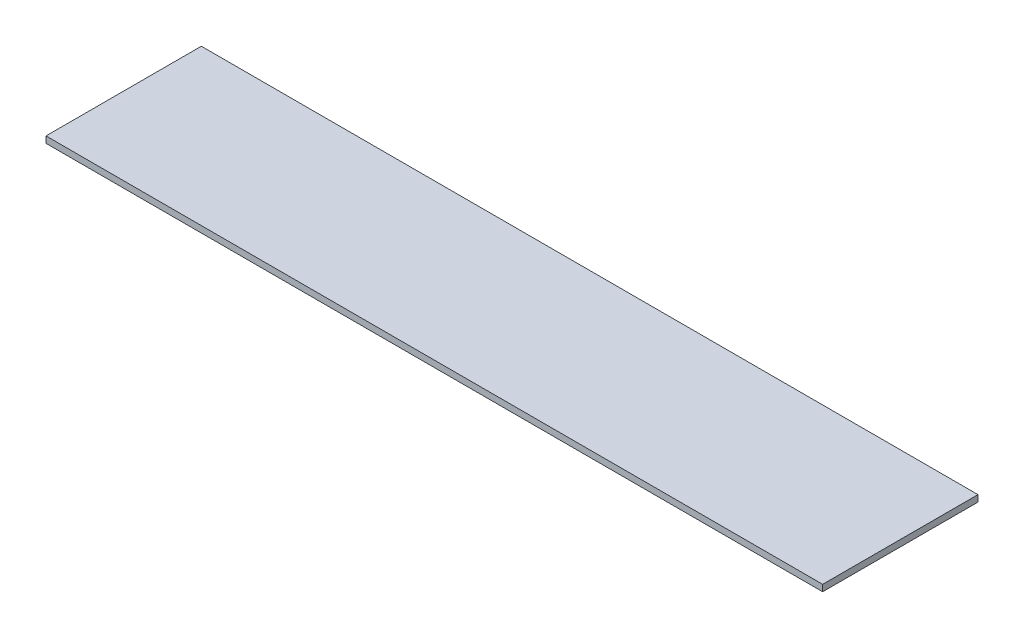
ISO-10303-21;
HEADER;
FILE_DESCRIPTION(('STEP AP214'),'2;1');
FILE_NAME('part.step','',(''),(''),'','','');
FILE_SCHEMA(('AUTOMOTIVE_DESIGN { 1 0 10303 214 1 1 1 1 }'));
ENDSEC;
DATA;
#1=APPLICATION_CONTEXT('core data for automotive mechanical design processes');
#2=APPLICATION_PROTOCOL_DEFINITION('international standard','automotive_design',2000,#1);
#3=PRODUCT_CONTEXT('',#1,'mechanical');
#4=PRODUCT('Part','Part','',(#3));
#5=PRODUCT_RELATED_PRODUCT_CATEGORY('part','',(#4));
#6=PRODUCT_DEFINITION_FORMATION('','',#4);
#7=PRODUCT_DEFINITION_CONTEXT('part definition',#1,'design');
#8=PRODUCT_DEFINITION('design','',#6,#7);
#9=PRODUCT_DEFINITION_SHAPE('','',#8);
#10=(LENGTH_UNIT() NAMED_UNIT(*) SI_UNIT(.MILLI.,.METRE.));
#11=(NAMED_UNIT(*) PLANE_ANGLE_UNIT() SI_UNIT($,.RADIAN.));
#12=(NAMED_UNIT(*) SI_UNIT($,.STERADIAN.) SOLID_ANGLE_UNIT());
#13=UNCERTAINTY_MEASURE_WITH_UNIT(LENGTH_MEASURE(1.E-05),#10,'distance_accuracy_value','');
#14=(GEOMETRIC_REPRESENTATION_CONTEXT(3) GLOBAL_UNCERTAINTY_ASSIGNED_CONTEXT((#13)) GLOBAL_UNIT_ASSIGNED_CONTEXT((#10,
#11,#12)) REPRESENTATION_CONTEXT('',''));
#15=CARTESIAN_POINT('',(0.,0.,0.));
#16=DIRECTION('',(0.,0.,1.));
#17=DIRECTION('',(1.,0.,0.));
#18=AXIS2_PLACEMENT_3D('',#15,#16,#17);
#19=CARTESIAN_POINT('',(0.,12.7,0.));
#20=DIRECTION('',(-1.,0.,0.));
#21=DIRECTION('',(0.,0.,1.));
#22=AXIS2_PLACEMENT_3D('',#19,#20,#21);
#23=PLANE('',#22);
#24=DIRECTION('',(0.,0.,-1.));
#25=VECTOR('',#24,1.);
#26=CARTESIAN_POINT('',(0.,0.,0.));
#27=LINE('',#26,#25);
#28=CARTESIAN_POINT('',(0.,0.,0.));
#29=VERTEX_POINT('',#28);
#30=CARTESIAN_POINT('',(0.,0.,-304.8));
#31=VERTEX_POINT('',#30);
#32=EDGE_CURVE('E96',#29,#31,#27,.T.);
#33=ORIENTED_EDGE('',*,*,#32,.T.);
#34=DIRECTION('',(0.,-1.,0.));
#35=VECTOR('',#34,1.);
#36=CARTESIAN_POINT('',(0.,12.7,-304.8));
#37=LINE('',#36,#35);
#38=CARTESIAN_POINT('',(0.,12.7,-304.8));
#39=VERTEX_POINT('',#38);
#40=EDGE_CURVE('E11',#39,#31,#37,.T.);
#41=ORIENTED_EDGE('',*,*,#40,.F.);
#42=DIRECTION('',(0.,0.,-1.));
#43=VECTOR('',#42,1.);
#44=CARTESIAN_POINT('',(0.,12.7,0.));
#45=LINE('',#44,#43);
#46=CARTESIAN_POINT('',(0.,12.7,0.));
#47=VERTEX_POINT('',#46);
#48=EDGE_CURVE('E82',#47,#39,#45,.T.);
#49=ORIENTED_EDGE('',*,*,#48,.F.);
#50=DIRECTION('',(0.,-1.,0.));
#51=VECTOR('',#50,1.);
#52=CARTESIAN_POINT('',(0.,12.7,0.));
#53=LINE('',#52,#51);
#54=EDGE_CURVE('E49',#47,#29,#53,.T.);
#55=ORIENTED_EDGE('',*,*,#54,.T.);
#56=EDGE_LOOP('',(#33,#41,#49,#55));
#57=FACE_BOUND('',#56,.T.);
#58=ADVANCED_FACE('F33',(#57),#23,.F.);
#59=CARTESIAN_POINT('',(0.,12.7,-304.8));
#60=DIRECTION('',(0.,0.,1.));
#61=DIRECTION('',(1.,0.,0.));
#62=AXIS2_PLACEMENT_3D('',#59,#60,#61);
#63=PLANE('',#62);
#64=DIRECTION('',(-1.,0.,0.));
#65=VECTOR('',#64,1.);
#66=CARTESIAN_POINT('',(0.,0.,-304.8));
#67=LINE('',#66,#65);
#68=CARTESIAN_POINT('',(-1524.,0.,-304.8));
#69=VERTEX_POINT('',#68);
#70=EDGE_CURVE('E87',#31,#69,#67,.T.);
#71=ORIENTED_EDGE('',*,*,#70,.T.);
#72=DIRECTION('',(0.,-1.,0.));
#73=VECTOR('',#72,1.);
#74=CARTESIAN_POINT('',(-1524.,12.7,-304.8));
#75=LINE('',#74,#73);
#76=CARTESIAN_POINT('',(-1524.,12.7,-304.8));
#77=VERTEX_POINT('',#76);
#78=EDGE_CURVE('E41',#77,#69,#75,.T.);
#79=ORIENTED_EDGE('',*,*,#78,.F.);
#80=DIRECTION('',(-1.,0.,0.));
#81=VECTOR('',#80,1.);
#82=CARTESIAN_POINT('',(0.,12.7,-304.8));
#83=LINE('',#82,#81);
#84=EDGE_CURVE('E74',#39,#77,#83,.T.);
#85=ORIENTED_EDGE('',*,*,#84,.F.);
#86=ORIENTED_EDGE('',*,*,#40,.T.);
#87=EDGE_LOOP('',(#71,#79,#85,#86));
#88=FACE_BOUND('',#87,.T.);
#89=ADVANCED_FACE('F86',(#88),#63,.F.);
#90=CARTESIAN_POINT('',(-1524.,12.7,1.86636172190057E-13));
#91=DIRECTION('',(-1.,0.,0.));
#92=DIRECTION('',(0.,0.,1.));
#93=AXIS2_PLACEMENT_3D('',#90,#91,#92);
#94=PLANE('',#93);
#95=DIRECTION('',(0.,0.,-1.));
#96=VECTOR('',#95,1.);
#97=CARTESIAN_POINT('',(-1524.,0.,1.86636172190057E-13));
#98=LINE('',#97,#96);
#99=CARTESIAN_POINT('',(-1524.,0.,1.86636172190057E-13));
#100=VERTEX_POINT('',#99);
#101=EDGE_CURVE('E99',#100,#69,#98,.T.);
#102=ORIENTED_EDGE('',*,*,#101,.F.);
#103=DIRECTION('',(0.,-1.,0.));
#104=VECTOR('',#103,1.);
#105=CARTESIAN_POINT('',(-1524.,12.7,1.86636172190057E-13));
#106=LINE('',#105,#104);
#107=CARTESIAN_POINT('',(-1524.,12.7,1.86636172190057E-13));
#108=VERTEX_POINT('',#107);
#109=EDGE_CURVE('E63',#108,#100,#106,.T.);
#110=ORIENTED_EDGE('',*,*,#109,.F.);
#111=DIRECTION('',(0.,0.,-1.));
#112=VECTOR('',#111,1.);
#113=CARTESIAN_POINT('',(-1524.,12.7,1.86636172190057E-13));
#114=LINE('',#113,#112);
#115=EDGE_CURVE('E81',#108,#77,#114,.T.);
#116=ORIENTED_EDGE('',*,*,#115,.T.);
#117=ORIENTED_EDGE('',*,*,#78,.T.);
#118=EDGE_LOOP('',(#102,#110,#116,#117));
#119=FACE_BOUND('',#118,.T.);
#120=ADVANCED_FACE('F90',(#119),#94,.T.);
#121=CARTESIAN_POINT('',(0.,12.7,0.));
#122=DIRECTION('',(0.,0.,1.));
#123=DIRECTION('',(1.,0.,0.));
#124=AXIS2_PLACEMENT_3D('',#121,#122,#123);
#125=PLANE('',#124);
#126=DIRECTION('',(-1.,0.,0.));
#127=VECTOR('',#126,1.);
#128=CARTESIAN_POINT('',(0.,0.,0.));
#129=LINE('',#128,#127);
#130=EDGE_CURVE('E101',#29,#100,#129,.T.);
#131=ORIENTED_EDGE('',*,*,#130,.F.);
#132=ORIENTED_EDGE('',*,*,#54,.F.);
#133=DIRECTION('',(-1.,0.,0.));
#134=VECTOR('',#133,1.);
#135=CARTESIAN_POINT('',(0.,12.7,0.));
#136=LINE('',#135,#134);
#137=EDGE_CURVE('E91',#47,#108,#136,.T.);
#138=ORIENTED_EDGE('',*,*,#137,.T.);
#139=ORIENTED_EDGE('',*,*,#109,.T.);
#140=EDGE_LOOP('',(#131,#132,#138,#139));
#141=FACE_BOUND('',#140,.T.);
#142=ADVANCED_FACE('F107',(#141),#125,.T.);
#143=CARTESIAN_POINT('',(0.,12.7,0.));
#144=DIRECTION('',(0.,1.,0.));
#145=DIRECTION('',(0.,0.,1.));
#146=AXIS2_PLACEMENT_3D('',#143,#144,#145);
#147=PLANE('',#146);
#148=ORIENTED_EDGE('',*,*,#48,.T.);
#149=ORIENTED_EDGE('',*,*,#84,.T.);
#150=ORIENTED_EDGE('',*,*,#115,.F.);
#151=ORIENTED_EDGE('',*,*,#137,.F.);
#152=EDGE_LOOP('',(#148,#149,#150,#151));
#153=FACE_BOUND('',#152,.T.);
#154=ADVANCED_FACE('F78',(#153),#147,.T.);
#155=CARTESIAN_POINT('',(0.,0.,0.));
#156=DIRECTION('',(0.,1.,0.));
#157=DIRECTION('',(0.,0.,1.));
#158=AXIS2_PLACEMENT_3D('',#155,#156,#157);
#159=PLANE('',#158);
#160=ORIENTED_EDGE('',*,*,#32,.F.);
#161=ORIENTED_EDGE('',*,*,#130,.T.);
#162=ORIENTED_EDGE('',*,*,#101,.T.);
#163=ORIENTED_EDGE('',*,*,#70,.F.);
#164=EDGE_LOOP('',(#160,#161,#162,#163));
#165=FACE_BOUND('',#164,.T.);
#166=ADVANCED_FACE('F106',(#165),#159,.F.);
#167=CLOSED_SHELL('',(#58,#89,#120,#142,#154,#166));
#168=MANIFOLD_SOLID_BREP('B2',#167);
#169=ADVANCED_BREP_SHAPE_REPRESENTATION('',(#18,#168),#14);
#170=SHAPE_DEFINITION_REPRESENTATION(#9,#169);
ENDSEC;
END-ISO-10303-21;
